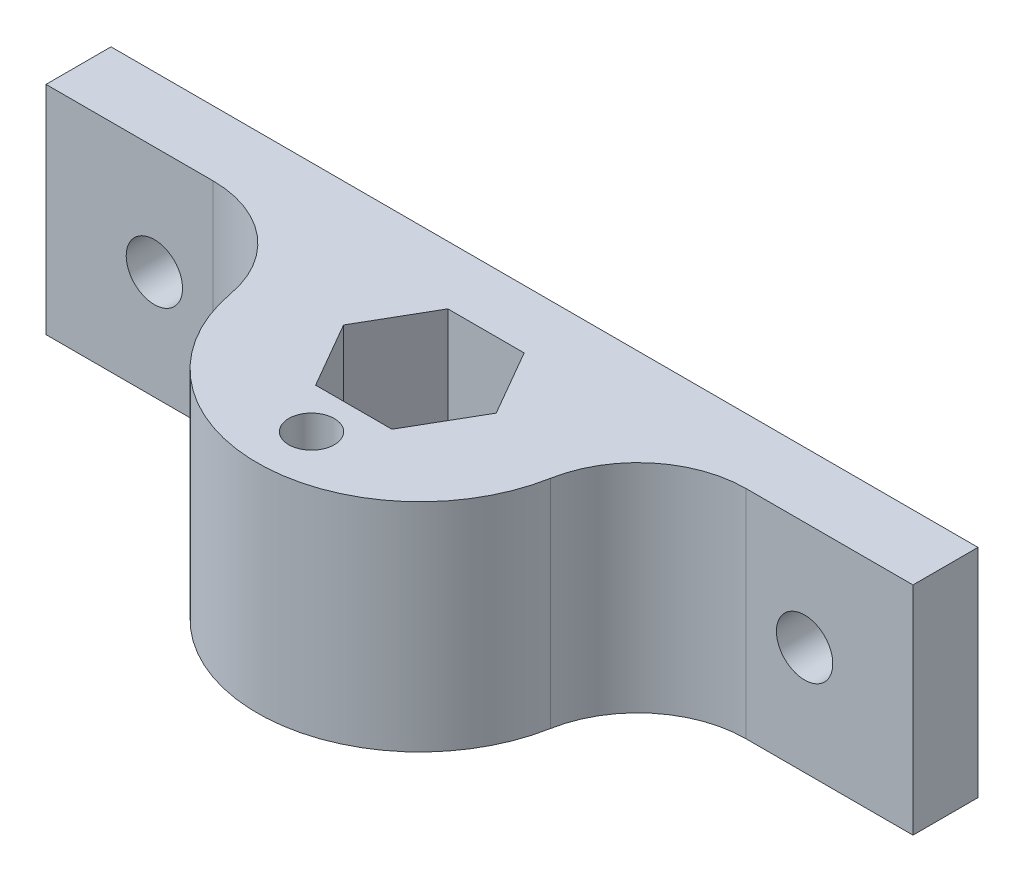
ISO-10303-21;
HEADER;
FILE_DESCRIPTION(('STEP AP214'),'2;1');
FILE_NAME('part.step','',(''),(''),'','','');
FILE_SCHEMA(('AUTOMOTIVE_DESIGN { 1 0 10303 214 1 1 1 1 }'));
ENDSEC;
DATA;
#1=APPLICATION_CONTEXT('core data for automotive mechanical design processes');
#2=APPLICATION_PROTOCOL_DEFINITION('international standard','automotive_design',2000,#1);
#3=PRODUCT_CONTEXT('',#1,'mechanical');
#4=PRODUCT('Part','Part','',(#3));
#5=PRODUCT_RELATED_PRODUCT_CATEGORY('part','',(#4));
#6=PRODUCT_DEFINITION_FORMATION('','',#4);
#7=PRODUCT_DEFINITION_CONTEXT('part definition',#1,'design');
#8=PRODUCT_DEFINITION('design','',#6,#7);
#9=PRODUCT_DEFINITION_SHAPE('','',#8);
#10=(LENGTH_UNIT() NAMED_UNIT(*) SI_UNIT(.MILLI.,.METRE.));
#11=(NAMED_UNIT(*) PLANE_ANGLE_UNIT() SI_UNIT($,.RADIAN.));
#12=(NAMED_UNIT(*) SI_UNIT($,.STERADIAN.) SOLID_ANGLE_UNIT());
#13=UNCERTAINTY_MEASURE_WITH_UNIT(LENGTH_MEASURE(1.E-05),#10,'distance_accuracy_value','');
#14=(GEOMETRIC_REPRESENTATION_CONTEXT(3) GLOBAL_UNCERTAINTY_ASSIGNED_CONTEXT((#13)) GLOBAL_UNIT_ASSIGNED_CONTEXT((#10,
#11,#12)) REPRESENTATION_CONTEXT('',''));
#15=CARTESIAN_POINT('',(0.,0.,0.));
#16=DIRECTION('',(0.,0.,1.));
#17=DIRECTION('',(1.,0.,0.));
#18=AXIS2_PLACEMENT_3D('',#15,#16,#17);
#19=CARTESIAN_POINT('',(-40.,20.,0.));
#20=DIRECTION('',(1.,0.,0.));
#21=DIRECTION('',(0.,0.,-1.));
#22=AXIS2_PLACEMENT_3D('',#19,#20,#21);
#23=PLANE('',#22);
#24=DIRECTION('',(0.,0.,1.));
#25=VECTOR('',#24,1.);
#26=CARTESIAN_POINT('',(-40.,0.,0.));
#27=LINE('',#26,#25);
#28=CARTESIAN_POINT('',(-40.,0.,0.));
#29=VERTEX_POINT('',#28);
#30=CARTESIAN_POINT('',(-40.,0.,6.00000000000001));
#31=VERTEX_POINT('',#30);
#32=EDGE_CURVE('E181',#29,#31,#27,.T.);
#33=ORIENTED_EDGE('',*,*,#32,.T.);
#34=DIRECTION('',(0.,-1.,0.));
#35=VECTOR('',#34,1.);
#36=CARTESIAN_POINT('',(-40.,20.,6.00000000000001));
#37=LINE('',#36,#35);
#38=CARTESIAN_POINT('',(-40.,20.,6.00000000000001));
#39=VERTEX_POINT('',#38);
#40=EDGE_CURVE('E224',#39,#31,#37,.T.);
#41=ORIENTED_EDGE('',*,*,#40,.F.);
#42=DIRECTION('',(0.,0.,1.));
#43=VECTOR('',#42,1.);
#44=CARTESIAN_POINT('',(-40.,20.,0.));
#45=LINE('',#44,#43);
#46=CARTESIAN_POINT('',(-40.,20.,0.));
#47=VERTEX_POINT('',#46);
#48=EDGE_CURVE('E192',#47,#39,#45,.T.);
#49=ORIENTED_EDGE('',*,*,#48,.F.);
#50=DIRECTION('',(0.,-1.,0.));
#51=VECTOR('',#50,1.);
#52=CARTESIAN_POINT('',(-40.,20.,0.));
#53=LINE('',#52,#51);
#54=EDGE_CURVE('E227',#47,#29,#53,.T.);
#55=ORIENTED_EDGE('',*,*,#54,.T.);
#56=EDGE_LOOP('',(#33,#41,#49,#55));
#57=FACE_BOUND('',#56,.T.);
#58=ADVANCED_FACE('F32',(#57),#23,.F.);
#59=CARTESIAN_POINT('',(-40.,20.,6.00000000000001));
#60=DIRECTION('',(0.,0.,-1.));
#61=DIRECTION('',(-1.,0.,0.));
#62=AXIS2_PLACEMENT_3D('',#59,#60,#61);
#63=PLANE('',#62);
#64=CARTESIAN_POINT('',(-30.,10.,6.00000000000001));
#65=DIRECTION('',(0.,0.,-1.));
#66=DIRECTION('',(-1.,0.,0.));
#67=AXIS2_PLACEMENT_3D('',#64,#65,#66);
#68=CIRCLE('',#67,2.6);
#69=CARTESIAN_POINT('',(-32.6,10.,6.00000000000001));
#70=VERTEX_POINT('',#69);
#71=EDGE_CURVE('E345',#70,#70,#68,.T.);
#72=ORIENTED_EDGE('',*,*,#71,.T.);
#73=EDGE_LOOP('',(#72));
#74=FACE_BOUND('',#73,.T.);
#75=DIRECTION('',(1.,0.,0.));
#76=VECTOR('',#75,1.);
#77=CARTESIAN_POINT('',(-40.,0.,6.00000000000001));
#78=LINE('',#77,#76);
#79=CARTESIAN_POINT('',(-24.5916652547159,0.,6.00000000000001));
#80=VERTEX_POINT('',#79);
#81=EDGE_CURVE('E208',#31,#80,#78,.T.);
#82=ORIENTED_EDGE('',*,*,#81,.T.);
#83=DIRECTION('',(0.,1.,0.));
#84=VECTOR('',#83,1.);
#85=CARTESIAN_POINT('',(-24.5916652547159,20.,6.00000000000001));
#86=LINE('',#85,#84);
#87=CARTESIAN_POINT('',(-24.5916652547159,20.,6.00000000000001));
#88=VERTEX_POINT('',#87);
#89=EDGE_CURVE('E235',#80,#88,#86,.T.);
#90=ORIENTED_EDGE('',*,*,#89,.T.);
#91=DIRECTION('',(1.,0.,0.));
#92=VECTOR('',#91,1.);
#93=CARTESIAN_POINT('',(-40.,20.,6.00000000000001));
#94=LINE('',#93,#92);
#95=EDGE_CURVE('E195',#39,#88,#94,.T.);
#96=ORIENTED_EDGE('',*,*,#95,.F.);
#97=ORIENTED_EDGE('',*,*,#40,.T.);
#98=EDGE_LOOP('',(#82,#90,#96,#97));
#99=FACE_BOUND('',#98,.T.);
#100=ADVANCED_FACE('F274',(#74,#99),#63,.F.);
#101=CARTESIAN_POINT('',(0.,20.,11.5));
#102=DIRECTION('',(0.,-1.,0.));
#103=DIRECTION('',(0.,0.,-1.));
#104=AXIS2_PLACEMENT_3D('',#101,#102,#103);
#105=CYLINDRICAL_SURFACE('',#104,15.);
#106=CARTESIAN_POINT('',(0.,20.,11.5));
#107=DIRECTION('',(0.,1.,0.));
#108=DIRECTION('',(0.,0.,1.));
#109=AXIS2_PLACEMENT_3D('',#106,#107,#108);
#110=CIRCLE('',#109,15.);
#111=CARTESIAN_POINT('',(-14.7549991528295,20.,14.2));
#112=VERTEX_POINT('',#111);
#113=CARTESIAN_POINT('',(14.7549991528295,20.,14.2));
#114=VERTEX_POINT('',#113);
#115=EDGE_CURVE('E198',#112,#114,#110,.T.);
#116=ORIENTED_EDGE('',*,*,#115,.F.);
#117=DIRECTION('',(0.,-1.,0.));
#118=VECTOR('',#117,1.);
#119=CARTESIAN_POINT('',(-14.7549991528295,20.,14.2));
#120=LINE('',#119,#118);
#121=CARTESIAN_POINT('',(-14.7549991528295,0.,14.2));
#122=VERTEX_POINT('',#121);
#123=EDGE_CURVE('E232',#112,#122,#120,.T.);
#124=ORIENTED_EDGE('',*,*,#123,.T.);
#125=CARTESIAN_POINT('',(0.,0.,11.5));
#126=DIRECTION('',(0.,1.,0.));
#127=DIRECTION('',(0.,0.,1.));
#128=AXIS2_PLACEMENT_3D('',#125,#126,#127);
#129=CIRCLE('',#128,15.);
#130=CARTESIAN_POINT('',(14.7549991528295,0.,14.2));
#131=VERTEX_POINT('',#130);
#132=EDGE_CURVE('E211',#122,#131,#129,.T.);
#133=ORIENTED_EDGE('',*,*,#132,.T.);
#134=DIRECTION('',(0.,-1.,0.));
#135=VECTOR('',#134,1.);
#136=CARTESIAN_POINT('',(14.7549991528295,20.,14.2));
#137=LINE('',#136,#135);
#138=EDGE_CURVE('E230',#131,#114,#137,.F.);
#139=ORIENTED_EDGE('',*,*,#138,.T.);
#140=EDGE_LOOP('',(#116,#124,#133,#139));
#141=FACE_BOUND('',#140,.T.);
#142=ADVANCED_FACE('F252',(#141),#105,.T.);
#143=CARTESIAN_POINT('',(40.,20.,6.));
#144=DIRECTION('',(0.,0.,-1.));
#145=DIRECTION('',(-1.,0.,0.));
#146=AXIS2_PLACEMENT_3D('',#143,#144,#145);
#147=PLANE('',#146);
#148=CARTESIAN_POINT('',(30.,10.,6.));
#149=DIRECTION('',(0.,0.,-1.));
#150=DIRECTION('',(-1.,0.,0.));
#151=AXIS2_PLACEMENT_3D('',#148,#149,#150);
#152=CIRCLE('',#151,2.6);
#153=CARTESIAN_POINT('',(27.4,10.,6.));
#154=VERTEX_POINT('',#153);
#155=EDGE_CURVE('E349',#154,#154,#152,.T.);
#156=ORIENTED_EDGE('',*,*,#155,.T.);
#157=EDGE_LOOP('',(#156));
#158=FACE_BOUND('',#157,.T.);
#159=DIRECTION('',(1.,0.,0.));
#160=VECTOR('',#159,1.);
#161=CARTESIAN_POINT('',(40.,20.,6.));
#162=LINE('',#161,#160);
#163=CARTESIAN_POINT('',(24.5916652547159,20.,6.00000000000001));
#164=VERTEX_POINT('',#163);
#165=CARTESIAN_POINT('',(40.,20.,6.));
#166=VERTEX_POINT('',#165);
#167=EDGE_CURVE('E201',#164,#166,#162,.T.);
#168=ORIENTED_EDGE('',*,*,#167,.F.);
#169=DIRECTION('',(0.,1.,0.));
#170=VECTOR('',#169,1.);
#171=CARTESIAN_POINT('',(24.5916652547159,0.,6.00000000000001));
#172=LINE('',#171,#170);
#173=CARTESIAN_POINT('',(24.5916652547159,0.,6.00000000000001));
#174=VERTEX_POINT('',#173);
#175=EDGE_CURVE('E237',#164,#174,#172,.F.);
#176=ORIENTED_EDGE('',*,*,#175,.T.);
#177=DIRECTION('',(1.,0.,0.));
#178=VECTOR('',#177,1.);
#179=CARTESIAN_POINT('',(40.,0.,6.));
#180=LINE('',#179,#178);
#181=CARTESIAN_POINT('',(40.,0.,6.));
#182=VERTEX_POINT('',#181);
#183=EDGE_CURVE('E214',#174,#182,#180,.T.);
#184=ORIENTED_EDGE('',*,*,#183,.T.);
#185=DIRECTION('',(0.,-1.,0.));
#186=VECTOR('',#185,1.);
#187=CARTESIAN_POINT('',(40.,20.,6.));
#188=LINE('',#187,#186);
#189=EDGE_CURVE('E221',#166,#182,#188,.T.);
#190=ORIENTED_EDGE('',*,*,#189,.F.);
#191=EDGE_LOOP('',(#168,#176,#184,#190));
#192=FACE_BOUND('',#191,.T.);
#193=ADVANCED_FACE('F260',(#158,#192),#147,.F.);
#194=CARTESIAN_POINT('',(40.,20.,0.));
#195=DIRECTION('',(-1.,0.,0.));
#196=DIRECTION('',(0.,0.,1.));
#197=AXIS2_PLACEMENT_3D('',#194,#195,#196);
#198=PLANE('',#197);
#199=DIRECTION('',(0.,0.,-1.));
#200=VECTOR('',#199,1.);
#201=CARTESIAN_POINT('',(40.,0.,0.));
#202=LINE('',#201,#200);
#203=CARTESIAN_POINT('',(40.,0.,0.));
#204=VERTEX_POINT('',#203);
#205=EDGE_CURVE('E216',#182,#204,#202,.T.);
#206=ORIENTED_EDGE('',*,*,#205,.T.);
#207=DIRECTION('',(0.,-1.,0.));
#208=VECTOR('',#207,1.);
#209=CARTESIAN_POINT('',(40.,20.,0.));
#210=LINE('',#209,#208);
#211=CARTESIAN_POINT('',(40.,20.,0.));
#212=VERTEX_POINT('',#211);
#213=EDGE_CURVE('E206',#212,#204,#210,.T.);
#214=ORIENTED_EDGE('',*,*,#213,.F.);
#215=DIRECTION('',(0.,0.,-1.));
#216=VECTOR('',#215,1.);
#217=CARTESIAN_POINT('',(40.,20.,0.));
#218=LINE('',#217,#216);
#219=EDGE_CURVE('E203',#166,#212,#218,.T.);
#220=ORIENTED_EDGE('',*,*,#219,.F.);
#221=ORIENTED_EDGE('',*,*,#189,.T.);
#222=EDGE_LOOP('',(#206,#214,#220,#221));
#223=FACE_BOUND('',#222,.T.);
#224=ADVANCED_FACE('F264',(#223),#198,.F.);
#225=CARTESIAN_POINT('',(0.,20.,0.));
#226=DIRECTION('',(0.,0.,1.));
#227=DIRECTION('',(1.,0.,0.));
#228=AXIS2_PLACEMENT_3D('',#225,#226,#227);
#229=PLANE('',#228);
#230=CARTESIAN_POINT('',(-30.,10.,0.));
#231=DIRECTION('',(0.,0.,-1.));
#232=DIRECTION('',(-1.,0.,0.));
#233=AXIS2_PLACEMENT_3D('',#230,#231,#232);
#234=CIRCLE('',#233,2.6);
#235=CARTESIAN_POINT('',(-32.6,10.,0.));
#236=VERTEX_POINT('',#235);
#237=EDGE_CURVE('E342',#236,#236,#234,.T.);
#238=ORIENTED_EDGE('',*,*,#237,.F.);
#239=EDGE_LOOP('',(#238));
#240=FACE_BOUND('',#239,.T.);
#241=CARTESIAN_POINT('',(30.,10.,0.));
#242=DIRECTION('',(0.,0.,-1.));
#243=DIRECTION('',(-1.,0.,0.));
#244=AXIS2_PLACEMENT_3D('',#241,#242,#243);
#245=CIRCLE('',#244,2.6);
#246=CARTESIAN_POINT('',(27.4,10.,0.));
#247=VERTEX_POINT('',#246);
#248=EDGE_CURVE('E346',#247,#247,#245,.T.);
#249=ORIENTED_EDGE('',*,*,#248,.F.);
#250=EDGE_LOOP('',(#249));
#251=FACE_BOUND('',#250,.T.);
#252=DIRECTION('',(-1.,0.,0.));
#253=VECTOR('',#252,1.);
#254=CARTESIAN_POINT('',(0.,0.,0.));
#255=LINE('',#254,#253);
#256=EDGE_CURVE('E193',#204,#29,#255,.T.);
#257=ORIENTED_EDGE('',*,*,#256,.T.);
#258=ORIENTED_EDGE('',*,*,#54,.F.);
#259=DIRECTION('',(-1.,0.,0.));
#260=VECTOR('',#259,1.);
#261=CARTESIAN_POINT('',(0.,20.,0.));
#262=LINE('',#261,#260);
#263=EDGE_CURVE('E189',#212,#47,#262,.T.);
#264=ORIENTED_EDGE('',*,*,#263,.F.);
#265=ORIENTED_EDGE('',*,*,#213,.T.);
#266=EDGE_LOOP('',(#257,#258,#264,#265));
#267=FACE_BOUND('',#266,.T.);
#268=ADVANCED_FACE('F268',(#240,#251,#267),#229,.F.);
#269=CARTESIAN_POINT('',(0.,20.,11.5));
#270=DIRECTION('',(0.,1.,0.));
#271=DIRECTION('',(0.,0.,1.));
#272=AXIS2_PLACEMENT_3D('',#269,#270,#271);
#273=PLANE('',#272);
#274=CARTESIAN_POINT('',(0.,20.,21.5));
#275=DIRECTION('',(0.,1.,0.));
#276=DIRECTION('',(0.,0.,1.));
#277=AXIS2_PLACEMENT_3D('',#274,#275,#276);
#278=CIRCLE('',#277,2.1);
#279=CARTESIAN_POINT('',(0.,20.,23.6));
#280=VERTEX_POINT('',#279);
#281=EDGE_CURVE('E157',#280,#280,#278,.T.);
#282=ORIENTED_EDGE('',*,*,#281,.F.);
#283=EDGE_LOOP('',(#282));
#284=FACE_BOUND('',#283,.T.);
#285=DIRECTION('',(-0.5,0.,0.866025403784439));
#286=VECTOR('',#285,1.);
#287=CARTESIAN_POINT('',(-3.52183664205672,20.,5.4));
#288=LINE('',#287,#286);
#289=CARTESIAN_POINT('',(-3.52183664205672,20.,5.4));
#290=VERTEX_POINT('',#289);
#291=CARTESIAN_POINT('',(-7.04367328411343,20.,11.5));
#292=VERTEX_POINT('',#291);
#293=EDGE_CURVE('E47',#290,#292,#288,.T.);
#294=ORIENTED_EDGE('',*,*,#293,.F.);
#295=DIRECTION('',(-1.,0.,0.));
#296=VECTOR('',#295,1.);
#297=CARTESIAN_POINT('',(3.52183664205672,20.,5.4));
#298=LINE('',#297,#296);
#299=CARTESIAN_POINT('',(3.52183664205672,20.,5.4));
#300=VERTEX_POINT('',#299);
#301=EDGE_CURVE('E151',#300,#290,#298,.T.);
#302=ORIENTED_EDGE('',*,*,#301,.F.);
#303=DIRECTION('',(-0.5,0.,-0.866025403784439));
#304=VECTOR('',#303,1.);
#305=CARTESIAN_POINT('',(7.04367328411344,20.,11.5));
#306=LINE('',#305,#304);
#307=CARTESIAN_POINT('',(7.04367328411344,20.,11.5));
#308=VERTEX_POINT('',#307);
#309=EDGE_CURVE('E154',#308,#300,#306,.T.);
#310=ORIENTED_EDGE('',*,*,#309,.F.);
#311=DIRECTION('',(0.5,0.,-0.866025403784439));
#312=VECTOR('',#311,1.);
#313=CARTESIAN_POINT('',(3.52183664205672,20.,17.6));
#314=LINE('',#313,#312);
#315=CARTESIAN_POINT('',(3.52183664205672,20.,17.6));
#316=VERTEX_POINT('',#315);
#317=EDGE_CURVE('E174',#316,#308,#314,.T.);
#318=ORIENTED_EDGE('',*,*,#317,.F.);
#319=DIRECTION('',(1.,0.,0.));
#320=VECTOR('',#319,1.);
#321=CARTESIAN_POINT('',(-3.52183664205672,20.,17.6));
#322=LINE('',#321,#320);
#323=CARTESIAN_POINT('',(-3.52183664205672,20.,17.6));
#324=VERTEX_POINT('',#323);
#325=EDGE_CURVE('E171',#324,#316,#322,.T.);
#326=ORIENTED_EDGE('',*,*,#325,.F.);
#327=DIRECTION('',(0.5,0.,0.866025403784438));
#328=VECTOR('',#327,1.);
#329=CARTESIAN_POINT('',(-7.04367328411343,20.,11.5));
#330=LINE('',#329,#328);
#331=EDGE_CURVE('E168',#292,#324,#330,.T.);
#332=ORIENTED_EDGE('',*,*,#331,.F.);
#333=EDGE_LOOP('',(#294,#302,#310,#318,#326,#332));
#334=FACE_BOUND('',#333,.T.);
#335=ORIENTED_EDGE('',*,*,#263,.T.);
#336=ORIENTED_EDGE('',*,*,#48,.T.);
#337=ORIENTED_EDGE('',*,*,#95,.T.);
#338=CARTESIAN_POINT('',(-24.5916652547159,20.,16.));
#339=DIRECTION('',(0.,1.,0.));
#340=DIRECTION('',(0.,0.,1.));
#341=AXIS2_PLACEMENT_3D('',#338,#339,#340);
#342=CIRCLE('',#341,10.);
#343=EDGE_CURVE('E242',#88,#112,#342,.F.);
#344=ORIENTED_EDGE('',*,*,#343,.T.);
#345=ORIENTED_EDGE('',*,*,#115,.T.);
#346=CARTESIAN_POINT('',(24.5916652547159,20.,16.));
#347=DIRECTION('',(0.,1.,0.));
#348=DIRECTION('',(0.,0.,1.));
#349=AXIS2_PLACEMENT_3D('',#346,#347,#348);
#350=CIRCLE('',#349,10.);
#351=EDGE_CURVE('E11',#114,#164,#350,.F.);
#352=ORIENTED_EDGE('',*,*,#351,.T.);
#353=ORIENTED_EDGE('',*,*,#167,.T.);
#354=ORIENTED_EDGE('',*,*,#219,.T.);
#355=EDGE_LOOP('',(#335,#336,#337,#344,#345,#352,#353,#354));
#356=FACE_BOUND('',#355,.T.);
#357=ADVANCED_FACE('F257',(#284,#334,#356),#273,.T.);
#358=CARTESIAN_POINT('',(0.,0.,11.5));
#359=DIRECTION('',(0.,1.,0.));
#360=DIRECTION('',(0.,0.,1.));
#361=AXIS2_PLACEMENT_3D('',#358,#359,#360);
#362=PLANE('',#361);
#363=CARTESIAN_POINT('',(0.,0.,21.5));
#364=DIRECTION('',(0.,1.,0.));
#365=DIRECTION('',(0.,0.,1.));
#366=AXIS2_PLACEMENT_3D('',#363,#364,#365);
#367=CIRCLE('',#366,2.1);
#368=CARTESIAN_POINT('',(0.,0.,23.6));
#369=VERTEX_POINT('',#368);
#370=EDGE_CURVE('E169',#369,#369,#367,.T.);
#371=ORIENTED_EDGE('',*,*,#370,.T.);
#372=EDGE_LOOP('',(#371));
#373=FACE_BOUND('',#372,.T.);
#374=DIRECTION('',(-1.,0.,0.));
#375=VECTOR('',#374,1.);
#376=CARTESIAN_POINT('',(3.52183664205672,0.,5.4));
#377=LINE('',#376,#375);
#378=CARTESIAN_POINT('',(3.52183664205672,0.,5.4));
#379=VERTEX_POINT('',#378);
#380=CARTESIAN_POINT('',(-3.52183664205672,0.,5.4));
#381=VERTEX_POINT('',#380);
#382=EDGE_CURVE('E140',#379,#381,#377,.T.);
#383=ORIENTED_EDGE('',*,*,#382,.T.);
#384=DIRECTION('',(-0.5,0.,0.866025403784439));
#385=VECTOR('',#384,1.);
#386=CARTESIAN_POINT('',(-3.52183664205672,0.,5.4));
#387=LINE('',#386,#385);
#388=CARTESIAN_POINT('',(-7.04367328411343,0.,11.5));
#389=VERTEX_POINT('',#388);
#390=EDGE_CURVE('E134',#381,#389,#387,.T.);
#391=ORIENTED_EDGE('',*,*,#390,.T.);
#392=DIRECTION('',(0.5,0.,0.866025403784438));
#393=VECTOR('',#392,1.);
#394=CARTESIAN_POINT('',(-7.04367328411343,0.,11.5));
#395=LINE('',#394,#393);
#396=CARTESIAN_POINT('',(-3.52183664205671,0.,17.6));
#397=VERTEX_POINT('',#396);
#398=EDGE_CURVE('E143',#389,#397,#395,.T.);
#399=ORIENTED_EDGE('',*,*,#398,.T.);
#400=DIRECTION('',(1.,0.,0.));
#401=VECTOR('',#400,1.);
#402=CARTESIAN_POINT('',(-3.52183664205672,0.,17.6));
#403=LINE('',#402,#401);
#404=CARTESIAN_POINT('',(3.52183664205672,0.,17.6));
#405=VERTEX_POINT('',#404);
#406=EDGE_CURVE('E55',#397,#405,#403,.T.);
#407=ORIENTED_EDGE('',*,*,#406,.T.);
#408=DIRECTION('',(0.5,0.,-0.866025403784439));
#409=VECTOR('',#408,1.);
#410=CARTESIAN_POINT('',(3.52183664205672,0.,17.6));
#411=LINE('',#410,#409);
#412=CARTESIAN_POINT('',(7.04367328411344,0.,11.5));
#413=VERTEX_POINT('',#412);
#414=EDGE_CURVE('E161',#405,#413,#411,.T.);
#415=ORIENTED_EDGE('',*,*,#414,.T.);
#416=DIRECTION('',(-0.5,0.,-0.866025403784439));
#417=VECTOR('',#416,1.);
#418=CARTESIAN_POINT('',(7.04367328411344,0.,11.5));
#419=LINE('',#418,#417);
#420=EDGE_CURVE('E164',#413,#379,#419,.T.);
#421=ORIENTED_EDGE('',*,*,#420,.T.);
#422=EDGE_LOOP('',(#383,#391,#399,#407,#415,#421));
#423=FACE_BOUND('',#422,.T.);
#424=ORIENTED_EDGE('',*,*,#32,.F.);
#425=ORIENTED_EDGE('',*,*,#256,.F.);
#426=ORIENTED_EDGE('',*,*,#205,.F.);
#427=ORIENTED_EDGE('',*,*,#183,.F.);
#428=CARTESIAN_POINT('',(24.5916652547159,0.,16.));
#429=DIRECTION('',(0.,1.,0.));
#430=DIRECTION('',(0.,0.,1.));
#431=AXIS2_PLACEMENT_3D('',#428,#429,#430);
#432=CIRCLE('',#431,10.);
#433=EDGE_CURVE('E40',#174,#131,#432,.T.);
#434=ORIENTED_EDGE('',*,*,#433,.T.);
#435=ORIENTED_EDGE('',*,*,#132,.F.);
#436=CARTESIAN_POINT('',(-24.5916652547159,0.,16.));
#437=DIRECTION('',(0.,1.,0.));
#438=DIRECTION('',(0.,0.,1.));
#439=AXIS2_PLACEMENT_3D('',#436,#437,#438);
#440=CIRCLE('',#439,10.);
#441=EDGE_CURVE('E240',#122,#80,#440,.T.);
#442=ORIENTED_EDGE('',*,*,#441,.T.);
#443=ORIENTED_EDGE('',*,*,#81,.F.);
#444=EDGE_LOOP('',(#424,#425,#426,#427,#434,#435,#442,#443));
#445=FACE_BOUND('',#444,.T.);
#446=ADVANCED_FACE('F147',(#373,#423,#445),#362,.F.);
#447=CARTESIAN_POINT('',(-24.5916652547159,20.,16.));
#448=DIRECTION('',(0.,-1.,0.));
#449=DIRECTION('',(0.,0.,-1.));
#450=AXIS2_PLACEMENT_3D('',#447,#448,#449);
#451=CYLINDRICAL_SURFACE('',#450,10.);
#452=ORIENTED_EDGE('',*,*,#343,.F.);
#453=ORIENTED_EDGE('',*,*,#89,.F.);
#454=ORIENTED_EDGE('',*,*,#441,.F.);
#455=ORIENTED_EDGE('',*,*,#123,.F.);
#456=EDGE_LOOP('',(#452,#453,#454,#455));
#457=FACE_BOUND('',#456,.T.);
#458=ADVANCED_FACE('F278',(#457),#451,.F.);
#459=CARTESIAN_POINT('',(24.5916652547159,20.,16.));
#460=DIRECTION('',(0.,-1.,0.));
#461=DIRECTION('',(0.,0.,-1.));
#462=AXIS2_PLACEMENT_3D('',#459,#460,#461);
#463=CYLINDRICAL_SURFACE('',#462,10.);
#464=ORIENTED_EDGE('',*,*,#351,.F.);
#465=ORIENTED_EDGE('',*,*,#138,.F.);
#466=ORIENTED_EDGE('',*,*,#433,.F.);
#467=ORIENTED_EDGE('',*,*,#175,.F.);
#468=EDGE_LOOP('',(#464,#465,#466,#467));
#469=FACE_BOUND('',#468,.T.);
#470=ADVANCED_FACE('F34',(#469),#463,.F.);
#471=CARTESIAN_POINT('',(-3.52183664205672,0.,5.4));
#472=DIRECTION('',(-0.866025403784439,0.,-0.5));
#473=DIRECTION('',(-0.5,0.,0.866025403784439));
#474=AXIS2_PLACEMENT_3D('',#471,#472,#473);
#475=PLANE('',#474);
#476=ORIENTED_EDGE('',*,*,#293,.T.);
#477=DIRECTION('',(0.,1.,0.));
#478=VECTOR('',#477,1.);
#479=CARTESIAN_POINT('',(-7.04367328411343,0.,11.5));
#480=LINE('',#479,#478);
#481=EDGE_CURVE('E130',#389,#292,#480,.T.);
#482=ORIENTED_EDGE('',*,*,#481,.F.);
#483=ORIENTED_EDGE('',*,*,#390,.F.);
#484=DIRECTION('',(0.,1.,0.));
#485=VECTOR('',#484,1.);
#486=CARTESIAN_POINT('',(-3.52183664205672,0.,5.4));
#487=LINE('',#486,#485);
#488=EDGE_CURVE('E179',#381,#290,#487,.T.);
#489=ORIENTED_EDGE('',*,*,#488,.T.);
#490=EDGE_LOOP('',(#476,#482,#483,#489));
#491=FACE_BOUND('',#490,.T.);
#492=ADVANCED_FACE('F132',(#491),#475,.F.);
#493=CARTESIAN_POINT('',(3.52183664205672,0.,5.4));
#494=DIRECTION('',(0.,0.,-1.));
#495=DIRECTION('',(-1.,0.,0.));
#496=AXIS2_PLACEMENT_3D('',#493,#494,#495);
#497=PLANE('',#496);
#498=ORIENTED_EDGE('',*,*,#301,.T.);
#499=ORIENTED_EDGE('',*,*,#488,.F.);
#500=ORIENTED_EDGE('',*,*,#382,.F.);
#501=DIRECTION('',(0.,1.,0.));
#502=VECTOR('',#501,1.);
#503=CARTESIAN_POINT('',(3.52183664205672,0.,5.4));
#504=LINE('',#503,#502);
#505=EDGE_CURVE('E182',#379,#300,#504,.T.);
#506=ORIENTED_EDGE('',*,*,#505,.T.);
#507=EDGE_LOOP('',(#498,#499,#500,#506));
#508=FACE_BOUND('',#507,.T.);
#509=ADVANCED_FACE('F309',(#508),#497,.F.);
#510=CARTESIAN_POINT('',(7.04367328411344,0.,11.5));
#511=DIRECTION('',(0.866025403784438,0.,-0.5));
#512=DIRECTION('',(-0.5,0.,-0.866025403784439));
#513=AXIS2_PLACEMENT_3D('',#510,#511,#512);
#514=PLANE('',#513);
#515=ORIENTED_EDGE('',*,*,#309,.T.);
#516=ORIENTED_EDGE('',*,*,#505,.F.);
#517=ORIENTED_EDGE('',*,*,#420,.F.);
#518=DIRECTION('',(0.,1.,0.));
#519=VECTOR('',#518,1.);
#520=CARTESIAN_POINT('',(7.04367328411344,0.,11.5));
#521=LINE('',#520,#519);
#522=EDGE_CURVE('E184',#413,#308,#521,.T.);
#523=ORIENTED_EDGE('',*,*,#522,.T.);
#524=EDGE_LOOP('',(#515,#516,#517,#523));
#525=FACE_BOUND('',#524,.T.);
#526=ADVANCED_FACE('F319',(#525),#514,.F.);
#527=CARTESIAN_POINT('',(3.52183664205672,0.,17.6));
#528=DIRECTION('',(0.866025403784439,0.,0.5));
#529=DIRECTION('',(0.5,0.,-0.866025403784439));
#530=AXIS2_PLACEMENT_3D('',#527,#528,#529);
#531=PLANE('',#530);
#532=ORIENTED_EDGE('',*,*,#317,.T.);
#533=ORIENTED_EDGE('',*,*,#522,.F.);
#534=ORIENTED_EDGE('',*,*,#414,.F.);
#535=DIRECTION('',(0.,1.,0.));
#536=VECTOR('',#535,1.);
#537=CARTESIAN_POINT('',(3.52183664205672,0.,17.6));
#538=LINE('',#537,#536);
#539=EDGE_CURVE('E186',#405,#316,#538,.T.);
#540=ORIENTED_EDGE('',*,*,#539,.T.);
#541=EDGE_LOOP('',(#532,#533,#534,#540));
#542=FACE_BOUND('',#541,.T.);
#543=ADVANCED_FACE('F316',(#542),#531,.F.);
#544=CARTESIAN_POINT('',(-3.52183664205672,0.,17.6));
#545=DIRECTION('',(0.,0.,1.));
#546=DIRECTION('',(1.,0.,0.));
#547=AXIS2_PLACEMENT_3D('',#544,#545,#546);
#548=PLANE('',#547);
#549=ORIENTED_EDGE('',*,*,#325,.T.);
#550=ORIENTED_EDGE('',*,*,#539,.F.);
#551=ORIENTED_EDGE('',*,*,#406,.F.);
#552=DIRECTION('',(0.,1.,0.));
#553=VECTOR('',#552,1.);
#554=CARTESIAN_POINT('',(-3.52183664205672,0.,17.6));
#555=LINE('',#554,#553);
#556=EDGE_CURVE('E139',#397,#324,#555,.T.);
#557=ORIENTED_EDGE('',*,*,#556,.T.);
#558=EDGE_LOOP('',(#549,#550,#551,#557));
#559=FACE_BOUND('',#558,.T.);
#560=ADVANCED_FACE('F313',(#559),#548,.F.);
#561=CARTESIAN_POINT('',(-7.04367328411343,0.,11.5));
#562=DIRECTION('',(-0.866025403784438,0.,0.5));
#563=DIRECTION('',(0.5,0.,0.866025403784438));
#564=AXIS2_PLACEMENT_3D('',#561,#562,#563);
#565=PLANE('',#564);
#566=ORIENTED_EDGE('',*,*,#331,.T.);
#567=ORIENTED_EDGE('',*,*,#556,.F.);
#568=ORIENTED_EDGE('',*,*,#398,.F.);
#569=ORIENTED_EDGE('',*,*,#481,.T.);
#570=EDGE_LOOP('',(#566,#567,#568,#569));
#571=FACE_BOUND('',#570,.T.);
#572=ADVANCED_FACE('F144',(#571),#565,.F.);
#573=CARTESIAN_POINT('',(0.,0.,21.5));
#574=DIRECTION('',(0.,1.,0.));
#575=DIRECTION('',(0.,0.,1.));
#576=AXIS2_PLACEMENT_3D('',#573,#574,#575);
#577=CYLINDRICAL_SURFACE('',#576,2.1);
#578=ORIENTED_EDGE('',*,*,#370,.F.);
#579=EDGE_LOOP('',(#578));
#580=FACE_BOUND('',#579,.T.);
#581=ORIENTED_EDGE('',*,*,#281,.T.);
#582=EDGE_LOOP('',(#581));
#583=FACE_BOUND('',#582,.T.);
#584=ADVANCED_FACE('F312',(#580,#583),#577,.F.);
#585=CARTESIAN_POINT('',(30.,10.,26.5));
#586=DIRECTION('',(0.,0.,-1.));
#587=DIRECTION('',(-1.,0.,0.));
#588=AXIS2_PLACEMENT_3D('',#585,#586,#587);
#589=CYLINDRICAL_SURFACE('',#588,2.6);
#590=ORIENTED_EDGE('',*,*,#248,.T.);
#591=EDGE_LOOP('',(#590));
#592=FACE_BOUND('',#591,.T.);
#593=ORIENTED_EDGE('',*,*,#155,.F.);
#594=EDGE_LOOP('',(#593));
#595=FACE_BOUND('',#594,.T.);
#596=ADVANCED_FACE('F329',(#592,#595),#589,.F.);
#597=CARTESIAN_POINT('',(-30.,10.,26.5));
#598=DIRECTION('',(0.,0.,-1.));
#599=DIRECTION('',(-1.,0.,0.));
#600=AXIS2_PLACEMENT_3D('',#597,#598,#599);
#601=CYLINDRICAL_SURFACE('',#600,2.6);
#602=ORIENTED_EDGE('',*,*,#237,.T.);
#603=EDGE_LOOP('',(#602));
#604=FACE_BOUND('',#603,.T.);
#605=ORIENTED_EDGE('',*,*,#71,.F.);
#606=EDGE_LOOP('',(#605));
#607=FACE_BOUND('',#606,.T.);
#608=ADVANCED_FACE('F333',(#604,#607),#601,.F.);
#609=CLOSED_SHELL('',(#58,#100,#142,#193,#224,#268,#357,#446,#458,#470,#492,#509,#526,#543,#560,
#572,#584,#596,#608));
#610=MANIFOLD_SOLID_BREP('B2',#609);
#611=ADVANCED_BREP_SHAPE_REPRESENTATION('',(#18,#610),#14);
#612=SHAPE_DEFINITION_REPRESENTATION(#9,#611);
ENDSEC;
END-ISO-10303-21;
